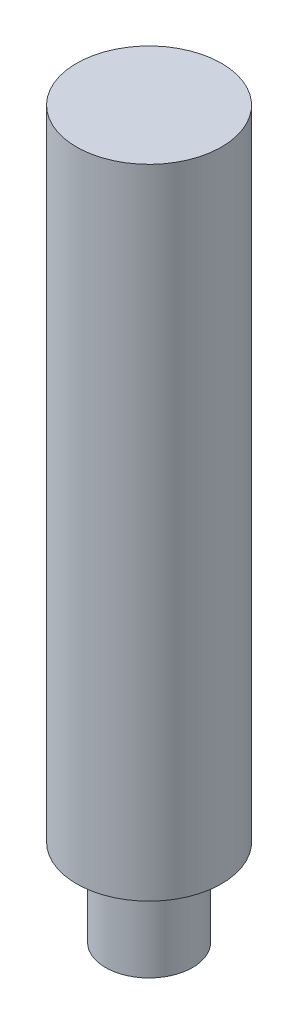
ISO-10303-21;
HEADER;
FILE_DESCRIPTION(('STEP AP214'),'2;1');
FILE_NAME('part.step','',(''),(''),'','','');
FILE_SCHEMA(('AUTOMOTIVE_DESIGN { 1 0 10303 214 1 1 1 1 }'));
ENDSEC;
DATA;
#1=APPLICATION_CONTEXT('core data for automotive mechanical design processes');
#2=APPLICATION_PROTOCOL_DEFINITION('international standard','automotive_design',2000,#1);
#3=PRODUCT_CONTEXT('',#1,'mechanical');
#4=PRODUCT('Part','Part','',(#3));
#5=PRODUCT_RELATED_PRODUCT_CATEGORY('part','',(#4));
#6=PRODUCT_DEFINITION_FORMATION('','',#4);
#7=PRODUCT_DEFINITION_CONTEXT('part definition',#1,'design');
#8=PRODUCT_DEFINITION('design','',#6,#7);
#9=PRODUCT_DEFINITION_SHAPE('','',#8);
#10=(LENGTH_UNIT() NAMED_UNIT(*) SI_UNIT(.MILLI.,.METRE.));
#11=(NAMED_UNIT(*) PLANE_ANGLE_UNIT() SI_UNIT($,.RADIAN.));
#12=(NAMED_UNIT(*) SI_UNIT($,.STERADIAN.) SOLID_ANGLE_UNIT());
#13=UNCERTAINTY_MEASURE_WITH_UNIT(LENGTH_MEASURE(1.E-05),#10,'distance_accuracy_value','');
#14=(GEOMETRIC_REPRESENTATION_CONTEXT(3) GLOBAL_UNCERTAINTY_ASSIGNED_CONTEXT((#13)) GLOBAL_UNIT_ASSIGNED_CONTEXT((#10,
#11,#12)) REPRESENTATION_CONTEXT('',''));
#15=CARTESIAN_POINT('',(0.,0.,0.));
#16=DIRECTION('',(0.,0.,1.));
#17=DIRECTION('',(1.,0.,0.));
#18=AXIS2_PLACEMENT_3D('',#15,#16,#17);
#19=CARTESIAN_POINT('',(0.,0.,-1.5));
#20=DIRECTION('',(0.,-1.,0.));
#21=DIRECTION('',(0.,0.,-1.));
#22=AXIS2_PLACEMENT_3D('',#19,#20,#21);
#23=PLANE('',#22);
#24=CARTESIAN_POINT('',(0.,0.,0.));
#25=DIRECTION('',(0.,-1.,0.));
#26=DIRECTION('',(0.,0.,-1.));
#27=AXIS2_PLACEMENT_3D('',#24,#25,#26);
#28=CIRCLE('',#27,1.5);
#29=CARTESIAN_POINT('',(0.,0.,-1.5));
#30=VERTEX_POINT('',#29);
#31=EDGE_CURVE('E48',#30,#30,#28,.T.);
#32=ORIENTED_EDGE('',*,*,#31,.T.);
#33=EDGE_LOOP('',(#32));
#34=FACE_BOUND('',#33,.T.);
#35=ADVANCED_FACE('F34',(#34),#23,.T.);
#36=CARTESIAN_POINT('',(0.,25.,0.));
#37=DIRECTION('',(0.,1.,0.));
#38=DIRECTION('',(0.,0.,1.));
#39=AXIS2_PLACEMENT_3D('',#36,#37,#38);
#40=PLANE('',#39);
#41=CARTESIAN_POINT('',(0.,25.,0.));
#42=DIRECTION('',(0.,-1.,0.));
#43=DIRECTION('',(0.,0.,-1.));
#44=AXIS2_PLACEMENT_3D('',#41,#42,#43);
#45=CIRCLE('',#44,2.5);
#46=CARTESIAN_POINT('',(0.,25.,-2.5));
#47=VERTEX_POINT('',#46);
#48=EDGE_CURVE('E10',#47,#47,#45,.T.);
#49=ORIENTED_EDGE('',*,*,#48,.F.);
#50=EDGE_LOOP('',(#49));
#51=FACE_BOUND('',#50,.T.);
#52=ADVANCED_FACE('F66',(#51),#40,.T.);
#53=CARTESIAN_POINT('',(0.,0.,0.));
#54=DIRECTION('',(0.,-1.,0.));
#55=DIRECTION('',(0.,0.,-1.));
#56=AXIS2_PLACEMENT_3D('',#53,#54,#55);
#57=CYLINDRICAL_SURFACE('',#56,2.5);
#58=ORIENTED_EDGE('',*,*,#48,.T.);
#59=EDGE_LOOP('',(#58));
#60=FACE_BOUND('',#59,.T.);
#61=CARTESIAN_POINT('',(0.,3.,0.));
#62=DIRECTION('',(0.,-1.,0.));
#63=DIRECTION('',(0.,0.,-1.));
#64=AXIS2_PLACEMENT_3D('',#61,#62,#63);
#65=CIRCLE('',#64,2.5);
#66=CARTESIAN_POINT('',(0.,3.,-2.5));
#67=VERTEX_POINT('',#66);
#68=EDGE_CURVE('E40',#67,#67,#65,.T.);
#69=ORIENTED_EDGE('',*,*,#68,.F.);
#70=EDGE_LOOP('',(#69));
#71=FACE_BOUND('',#70,.T.);
#72=ADVANCED_FACE('F63',(#60,#71),#57,.T.);
#73=CARTESIAN_POINT('',(0.,3.,-2.5));
#74=DIRECTION('',(0.,-1.,0.));
#75=DIRECTION('',(0.,0.,-1.));
#76=AXIS2_PLACEMENT_3D('',#73,#74,#75);
#77=PLANE('',#76);
#78=ORIENTED_EDGE('',*,*,#68,.T.);
#79=EDGE_LOOP('',(#78));
#80=FACE_BOUND('',#79,.T.);
#81=CARTESIAN_POINT('',(0.,3.,0.));
#82=DIRECTION('',(0.,-1.,0.));
#83=DIRECTION('',(0.,0.,-1.));
#84=AXIS2_PLACEMENT_3D('',#81,#82,#83);
#85=CIRCLE('',#84,1.5);
#86=CARTESIAN_POINT('',(0.,3.,-1.5));
#87=VERTEX_POINT('',#86);
#88=EDGE_CURVE('E44',#87,#87,#85,.T.);
#89=ORIENTED_EDGE('',*,*,#88,.F.);
#90=EDGE_LOOP('',(#89));
#91=FACE_BOUND('',#90,.T.);
#92=ADVANCED_FACE('F57',(#80,#91),#77,.T.);
#93=CARTESIAN_POINT('',(0.,0.,0.));
#94=DIRECTION('',(0.,-1.,0.));
#95=DIRECTION('',(0.,0.,-1.));
#96=AXIS2_PLACEMENT_3D('',#93,#94,#95);
#97=CYLINDRICAL_SURFACE('',#96,1.5);
#98=ORIENTED_EDGE('',*,*,#88,.T.);
#99=EDGE_LOOP('',(#98));
#100=FACE_BOUND('',#99,.T.);
#101=ORIENTED_EDGE('',*,*,#31,.F.);
#102=EDGE_LOOP('',(#101));
#103=FACE_BOUND('',#102,.T.);
#104=ADVANCED_FACE('F55',(#100,#103),#97,.T.);
#105=CLOSED_SHELL('',(#35,#52,#72,#92,#104));
#106=MANIFOLD_SOLID_BREP('B2',#105);
#107=ADVANCED_BREP_SHAPE_REPRESENTATION('',(#18,#106),#14);
#108=SHAPE_DEFINITION_REPRESENTATION(#9,#107);
ENDSEC;
END-ISO-10303-21;
